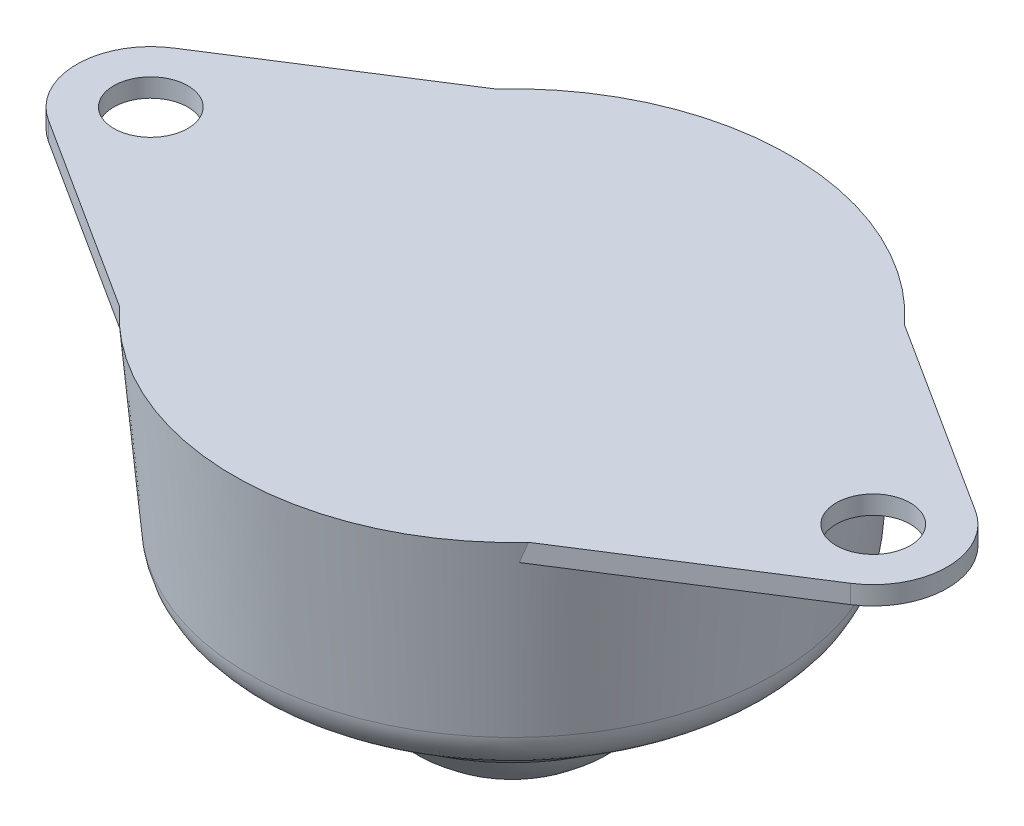
ISO-10303-21;
HEADER;
FILE_DESCRIPTION(('STEP AP214'),'2;1');
FILE_NAME('part.step','',(''),(''),'','','');
FILE_SCHEMA(('AUTOMOTIVE_DESIGN { 1 0 10303 214 1 1 1 1 }'));
ENDSEC;
DATA;
#1=APPLICATION_CONTEXT('core data for automotive mechanical design processes');
#2=APPLICATION_PROTOCOL_DEFINITION('international standard','automotive_design',2000,#1);
#3=PRODUCT_CONTEXT('',#1,'mechanical');
#4=PRODUCT('Part','Part','',(#3));
#5=PRODUCT_RELATED_PRODUCT_CATEGORY('part','',(#4));
#6=PRODUCT_DEFINITION_FORMATION('','',#4);
#7=PRODUCT_DEFINITION_CONTEXT('part definition',#1,'design');
#8=PRODUCT_DEFINITION('design','',#6,#7);
#9=PRODUCT_DEFINITION_SHAPE('','',#8);
#10=(LENGTH_UNIT() NAMED_UNIT(*) SI_UNIT(.MILLI.,.METRE.));
#11=(NAMED_UNIT(*) PLANE_ANGLE_UNIT() SI_UNIT($,.RADIAN.));
#12=(NAMED_UNIT(*) SI_UNIT($,.STERADIAN.) SOLID_ANGLE_UNIT());
#13=UNCERTAINTY_MEASURE_WITH_UNIT(LENGTH_MEASURE(1.E-05),#10,'distance_accuracy_value','');
#14=(GEOMETRIC_REPRESENTATION_CONTEXT(3) GLOBAL_UNCERTAINTY_ASSIGNED_CONTEXT((#13)) GLOBAL_UNIT_ASSIGNED_CONTEXT((#10,
#11,#12)) REPRESENTATION_CONTEXT('',''));
#15=CARTESIAN_POINT('',(0.,0.,0.));
#16=DIRECTION('',(0.,0.,1.));
#17=DIRECTION('',(1.,0.,0.));
#18=AXIS2_PLACEMENT_3D('',#15,#16,#17);
#19=CARTESIAN_POINT('',(0.,-12.,0.));
#20=DIRECTION('',(0.,1.,0.));
#21=DIRECTION('',(-1.,0.,0.));
#22=AXIS2_PLACEMENT_3D('',#19,#20,#21);
#23=CONICAL_SURFACE('',#22,13.9501360376889,0.0872664625997199);
#24=CARTESIAN_POINT('',(0.,-9.71788935686915,0.));
#25=DIRECTION('',(0.,-1.,0.));
#26=DIRECTION('',(1.,0.,0.));
#27=AXIS2_PLACEMENT_3D('',#24,#25,#26);
#28=CIRCLE('',#27,14.1497948478747);
#29=CARTESIAN_POINT('',(14.1497948478747,-9.71788935686915,0.));
#30=VERTEX_POINT('',#29);
#31=EDGE_CURVE('E179',#30,#30,#28,.F.);
#32=ORIENTED_EDGE('',*,*,#31,.T.);
#33=EDGE_LOOP('',(#32));
#34=FACE_BOUND('',#33,.T.);
#35=CARTESIAN_POINT('',(12.6583742323133,6.86786284112785,9.11879372184378));
#36=CARTESIAN_POINT('',(12.6003920496443,6.57767843199839,9.15584489612186));
#37=CARTESIAN_POINT('',(12.5415679806933,6.28773168787597,9.19343404385869));
#38=CARTESIAN_POINT('',(12.4220281046813,5.70837926078128,9.26982117824068));
#39=CARTESIAN_POINT('',(12.3613122422712,5.41897359390268,9.3086192002545));
#40=CARTESIAN_POINT('',(12.1759267618882,4.55125514052083,9.42708231126748));
#41=CARTESIAN_POINT('',(12.0481063039624,3.9738799369211,9.5087608174035));
#42=CARTESIAN_POINT('',(11.7809105112832,2.81904871818081,9.67950150747788));
#43=CARTESIAN_POINT('',(11.6414685443511,2.24161432917767,9.76860627002136));
#44=CARTESIAN_POINT('',(11.3481671171094,1.0920573045864,9.95602871251161));
#45=CARTESIAN_POINT('',(11.1943129585583,0.519932800133823,10.0543430045834));
#46=CARTESIAN_POINT('',(10.9481549744478,-0.331422569697724,10.2116403319586));
#47=CARTESIAN_POINT('',(10.8636242908518,-0.613812602272261,10.2656562545333));
#48=CARTESIAN_POINT('',(10.6881103271886,-1.17584691725177,10.377811371098));
#49=CARTESIAN_POINT('',(10.597125541667,-1.45549054160999,10.4359515270879));
#50=CARTESIAN_POINT('',(10.4069072627371,-2.01114242510658,10.557502843011));
#51=CARTESIAN_POINT('',(10.3076663059839,-2.28714712789051,10.6209187720934));
#52=CARTESIAN_POINT('',(10.0984116977191,-2.8332083135398,10.7546344861701));
#53=CARTESIAN_POINT('',(9.98840361850947,-3.10326778551585,10.8249307104095));
#54=CARTESIAN_POINT('',(9.75267029312679,-3.63588145293457,10.9755665802552));
#55=CARTESIAN_POINT('',(9.62685850941329,-3.89838371025872,11.0559615241851));
#56=CARTESIAN_POINT('',(9.42120113804195,-4.27864714837666,11.1873785691719));
#57=CARTESIAN_POINT('',(9.34997303841065,-4.40293529280569,11.2328940122176));
#58=CARTESIAN_POINT('',(9.2002552075637,-4.64513772320572,11.3285651509691));
#59=CARTESIAN_POINT('',(9.12177271011219,-4.76305817673404,11.3787162242299));
#60=CARTESIAN_POINT('',(8.97781755298206,-4.95876028268787,11.4707049588642));
#61=CARTESIAN_POINT('',(8.91453862597464,-5.03879500540498,11.5111408038903));
#62=CARTESIAN_POINT('',(8.78173412348313,-5.19165304877882,11.596004162602));
#63=CARTESIAN_POINT('',(8.71219721746067,-5.26446276589662,11.6404389166109));
#64=CARTESIAN_POINT('',(8.56493023236199,-5.40007766312354,11.7345439412776));
#65=CARTESIAN_POINT('',(8.48710766081557,-5.46274467828114,11.7842733155165));
#66=CARTESIAN_POINT('',(8.32347478134087,-5.57107922383824,11.8888363046272));
#67=CARTESIAN_POINT('',(8.23769722796723,-5.61681290289329,11.9436489890226));
#68=CARTESIAN_POINT('',(8.08917177595315,-5.67301673193245,12.038558186193));
#69=CARTESIAN_POINT('',(8.02823240777572,-5.69015337123608,12.0774990305491));
#70=CARTESIAN_POINT('',(7.90479060898928,-5.71189795401319,12.1563795312391));
#71=CARTESIAN_POINT('',(7.84228981093424,-5.71651847245105,12.1963181443554));
#72=CARTESIAN_POINT('',(7.7175445664058,-5.71267739152537,12.2760315594534));
#73=CARTESIAN_POINT('',(7.65530030504937,-5.70420759514527,12.3158062431436));
#74=CARTESIAN_POINT('',(7.53283655176791,-5.67518624644612,12.3940617633175));
#75=CARTESIAN_POINT('',(7.47261963795462,-5.65461988251372,12.4325409523628));
#76=CARTESIAN_POINT('',(7.33226393302822,-5.59331193452866,12.5222296023027));
#77=CARTESIAN_POINT('',(7.25361825914272,-5.5478147473501,12.5724849468795));
#78=CARTESIAN_POINT('',(7.1032543698956,-5.44294617875783,12.6685689231835));
#79=CARTESIAN_POINT('',(7.03155340028663,-5.38354144952876,12.7143865347083));
#80=CARTESIAN_POINT('',(6.8348672379271,-5.19964484447264,12.8400708905607));
#81=CARTESIAN_POINT('',(6.71776497186566,-5.06347438771679,12.9149003686603));
#82=CARTESIAN_POINT('',(6.49951128899083,-4.774290494307,13.0543665782576));
#83=CARTESIAN_POINT('',(6.39842194718122,-4.62121523580234,13.1189636432288));
#84=CARTESIAN_POINT('',(6.21841992958215,-4.32275920204267,13.2339866695702));
#85=CARTESIAN_POINT('',(6.13829107086148,-4.17839918396337,13.28518978357));
#86=CARTESIAN_POINT('',(5.98511045483865,-3.88444723663065,13.3830736754663));
#87=CARTESIAN_POINT('',(5.91206274086595,-3.73485238386288,13.4297518696362));
#88=CARTESIAN_POINT('',(5.70093379344831,-3.28005139933578,13.5646653045197));
#89=CARTESIAN_POINT('',(5.5711977808386,-2.96941549621123,13.6475678685846));
#90=CARTESIAN_POINT('',(5.32557992054976,-2.33768864249139,13.8045200516254));
#91=CARTESIAN_POINT('',(5.20982009466687,-2.01653295036784,13.8784916974958));
#92=CARTESIAN_POINT('',(4.98936861817535,-1.36943823208632,14.0193623184238));
#93=CARTESIAN_POINT('',(4.88466264647898,-1.04350603390933,14.0862704447947));
#94=CARTESIAN_POINT('',(4.68751355006937,-0.401089837334021,14.2122506199725));
#95=CARTESIAN_POINT('',(4.59474887646277,-0.0847433650281615,14.2715281416254));
#96=CARTESIAN_POINT('',(4.41531388405231,0.550387216121785,14.3861888333992));
#97=CARTESIAN_POINT('',(4.32864399977681,0.869171496976751,14.4415717258523));
#98=CARTESIAN_POINT('',(4.07591071562002,1.82882077467615,14.6030707334115));
#99=CARTESIAN_POINT('',(3.91728497669503,2.4724404776392,14.70443411139));
#100=CARTESIAN_POINT('',(3.61971486826424,3.74031824024328,14.8945842823546));
#101=CARTESIAN_POINT('',(3.48025900595239,4.36440999304523,14.9836979241799));
#102=CARTESIAN_POINT('',(3.27869181198459,5.30230563542418,15.112501306334));
#103=CARTESIAN_POINT('',(3.21282174743899,5.61498014378576,15.1545929132526));
#104=CARTESIAN_POINT('',(3.08331146192763,6.24096588521668,15.2373512355233));
#105=CARTESIAN_POINT('',(3.01967115057998,6.55427709193186,15.2780180086304));
#106=CARTESIAN_POINT('',(2.95701038307129,6.86786284112785,15.3180588437713));
#107=B_SPLINE_CURVE_WITH_KNOTS('',3,(#35,#36,#37,#38,#39,#40,#41,#42,#43,#44,#45,#46,#47,#48,
#49,#50,#51,#52,#53,#54,#55,#56,#57,#58,#59,#60,#61,#62,#63,#64,#65,#66,#67,#68,#69,#70,#71,#72,
#73,#74,#75,#76,#77,#78,#79,#80,#81,#82,#83,#84,#85,#86,#87,#88,#89,#90,#91,#92,#93,#94,#95,#96,
#97,#98,#99,#100,#101,#102,#103,#104,#105,#106),.UNSPECIFIED.,.F.,.F.,(4,2,2,2,2,2,2,2,2,2,2,2,
2,2,2,2,2,2,2,2,2,2,2,2,2,2,2,2,2,2,2,2,2,2,2,4),(0.,0.894688593174714,1.78940338734534,
3.58018590400965,5.38205427533142,7.1832623838613,8.0822147917833,8.98137757914064,
9.88136220507501,10.7808835008772,11.6855646576258,12.1362372623643,12.5864652270306,
12.9153616655255,13.2448660597731,13.5785374709185,13.9108913156082,14.1329073008202,
14.3547001433793,14.5766319265494,14.7988360209436,15.1085441479165,15.4190026467229,
15.9994285339049,16.5820521399264,17.1002532676922,17.6187485662948,18.6578487684493,
19.7054497064294,20.751676298618,21.7564364804973,22.7612682243388,24.7726541406673,
26.7095070389096,27.6763905761342,28.6432348757821),.UNSPECIFIED.);
#108=CARTESIAN_POINT('',(11.0439513796866,0.,10.1504255045352));
#109=VERTEX_POINT('',#108);
#110=CARTESIAN_POINT('',(10.7428488494448,-0.999999999999999,10.3428329271264));
#111=VERTEX_POINT('',#110);
#112=EDGE_CURVE('E119',#109,#111,#107,.T.);
#113=ORIENTED_EDGE('',*,*,#112,.F.);
#114=CARTESIAN_POINT('',(0.,0.,0.));
#115=DIRECTION('',(0.,1.,0.));
#116=DIRECTION('',(-1.,0.,0.));
#117=AXIS2_PLACEMENT_3D('',#114,#115,#116);
#118=CIRCLE('',#117,15.);
#119=CARTESIAN_POINT('',(-11.0439513796865,0.,10.1504255045353));
#120=VERTEX_POINT('',#119);
#121=EDGE_CURVE('E171',#120,#109,#118,.T.);
#122=ORIENTED_EDGE('',*,*,#121,.F.);
#123=CARTESIAN_POINT('',(-12.6583742323133,6.86786284112785,9.11879372184379));
#124=CARTESIAN_POINT('',(-12.6003920496443,6.57767843199839,9.15584489612187));
#125=CARTESIAN_POINT('',(-12.5415679806933,6.28773168787597,9.1934340438587));
#126=CARTESIAN_POINT('',(-12.4220281046813,5.70837926078128,9.26982117824069));
#127=CARTESIAN_POINT('',(-12.3613122422712,5.41897359390268,9.30861920025451));
#128=CARTESIAN_POINT('',(-12.1759267618882,4.55125514052084,9.42708231126749));
#129=CARTESIAN_POINT('',(-12.0481063039624,3.97387993692111,9.50876081740351));
#130=CARTESIAN_POINT('',(-11.7809105112832,2.81904871818081,9.67950150747788));
#131=CARTESIAN_POINT('',(-11.6414685443511,2.24161432917767,9.76860627002136));
#132=CARTESIAN_POINT('',(-11.3481671171094,1.0920573045864,9.95602871251161));
#133=CARTESIAN_POINT('',(-11.1943129585583,0.519932800133821,10.0543430045834));
#134=CARTESIAN_POINT('',(-10.9481549744478,-0.331422569697725,10.2116403319586));
#135=CARTESIAN_POINT('',(-10.8636242908518,-0.61381260227226,10.2656562545333));
#136=CARTESIAN_POINT('',(-10.6881103271886,-1.17584691725177,10.377811371098));
#137=CARTESIAN_POINT('',(-10.597125541667,-1.45549054160999,10.4359515270879));
#138=CARTESIAN_POINT('',(-10.4069072627371,-2.01114242510658,10.557502843011));
#139=CARTESIAN_POINT('',(-10.3076663059839,-2.28714712789051,10.6209187720934));
#140=CARTESIAN_POINT('',(-10.0984116977191,-2.8332083135398,10.7546344861701));
#141=CARTESIAN_POINT('',(-9.98840361850948,-3.10326778551586,10.8249307104095));
#142=CARTESIAN_POINT('',(-9.75267029312679,-3.63588145293456,10.9755665802552));
#143=CARTESIAN_POINT('',(-9.62685850941328,-3.89838371025871,11.0559615241851));
#144=CARTESIAN_POINT('',(-9.42120113804195,-4.27864714837665,11.1873785691719));
#145=CARTESIAN_POINT('',(-9.34997303841065,-4.40293529280569,11.2328940122176));
#146=CARTESIAN_POINT('',(-9.2002552075637,-4.64513772320572,11.3285651509691));
#147=CARTESIAN_POINT('',(-9.1217727101122,-4.76305817673405,11.3787162242299));
#148=CARTESIAN_POINT('',(-8.97781755298205,-4.95876028268786,11.4707049588642));
#149=CARTESIAN_POINT('',(-8.91453862597462,-5.03879500540496,11.5111408038903));
#150=CARTESIAN_POINT('',(-8.7817341234831,-5.1916530487788,11.596004162602));
#151=CARTESIAN_POINT('',(-8.71219721746065,-5.2644627658966,11.6404389166109));
#152=CARTESIAN_POINT('',(-8.56493023236197,-5.40007766312352,11.7345439412776));
#153=CARTESIAN_POINT('',(-8.48710766081555,-5.46274467828113,11.7842733155165));
#154=CARTESIAN_POINT('',(-8.32347478134085,-5.57107922383821,11.8888363046273));
#155=CARTESIAN_POINT('',(-8.23769722796721,-5.61681290289326,11.9436489890227));
#156=CARTESIAN_POINT('',(-8.08917177595313,-5.67301673193242,12.038558186193));
#157=CARTESIAN_POINT('',(-8.0282324077757,-5.69015337123605,12.0774990305491));
#158=CARTESIAN_POINT('',(-7.90479060898927,-5.71189795401317,12.1563795312392));
#159=CARTESIAN_POINT('',(-7.84228981093422,-5.71651847245103,12.1963181443554));
#160=CARTESIAN_POINT('',(-7.71754456640578,-5.71267739152537,12.2760315594535));
#161=CARTESIAN_POINT('',(-7.65530030504935,-5.70420759514528,12.3158062431437));
#162=CARTESIAN_POINT('',(-7.53283655176789,-5.67518624644612,12.3940617633175));
#163=CARTESIAN_POINT('',(-7.4726196379546,-5.65461988251371,12.4325409523629));
#164=CARTESIAN_POINT('',(-7.3322639330282,-5.59331193452862,12.5222296023027));
#165=CARTESIAN_POINT('',(-7.2536182591427,-5.54781474735009,12.5724849468795));
#166=CARTESIAN_POINT('',(-7.10325436989557,-5.44294617875783,12.6685689231835));
#167=CARTESIAN_POINT('',(-7.0315534002866,-5.38354144952875,12.7143865347083));
#168=CARTESIAN_POINT('',(-6.83486723792708,-5.19964484447261,12.8400708905607));
#169=CARTESIAN_POINT('',(-6.71776497186564,-5.06347438771675,12.9149003686603));
#170=CARTESIAN_POINT('',(-6.49951128899081,-4.77429049430696,13.0543665782576));
#171=CARTESIAN_POINT('',(-6.39842194718119,-4.62121523580229,13.1189636432288));
#172=CARTESIAN_POINT('',(-6.21841992958212,-4.32275920204261,13.2339866695702));
#173=CARTESIAN_POINT('',(-6.13829107086145,-4.17839918396331,13.2851897835701));
#174=CARTESIAN_POINT('',(-5.98511045483861,-3.88444723663057,13.3830736754664));
#175=CARTESIAN_POINT('',(-5.9120627408659,-3.7348523838628,13.4297518696362));
#176=CARTESIAN_POINT('',(-5.70093379344825,-3.28005139933568,13.5646653045197));
#177=CARTESIAN_POINT('',(-5.57119778083855,-2.96941549621111,13.6475678685846));
#178=CARTESIAN_POINT('',(-5.3255799205497,-2.33768864249125,13.8045200516254));
#179=CARTESIAN_POINT('',(-5.20982009466681,-2.01653295036769,13.8784916974958));
#180=CARTESIAN_POINT('',(-4.98936861817528,-1.36943823208614,14.0193623184238));
#181=CARTESIAN_POINT('',(-4.88466264647892,-1.04350603390914,14.0862704447947));
#182=CARTESIAN_POINT('',(-4.68751355006932,-0.401089837333831,14.2122506199725));
#183=CARTESIAN_POINT('',(-4.59474887646272,-0.0847433650279833,14.2715281416255));
#184=CARTESIAN_POINT('',(-4.41531388405226,0.550387216121942,14.3861888333993));
#185=CARTESIAN_POINT('',(-4.32864399977677,0.869171496976898,14.4415717258523));
#186=CARTESIAN_POINT('',(-4.07591071561999,1.82882077467626,14.6030707334115));
#187=CARTESIAN_POINT('',(-3.917284976695,2.4724404776393,14.70443411139));
#188=CARTESIAN_POINT('',(-3.61971486826422,3.74031824024334,14.8945842823546));
#189=CARTESIAN_POINT('',(-3.48025900595237,4.36440999304528,14.9836979241799));
#190=CARTESIAN_POINT('',(-3.27869181198458,5.30230563542422,15.112501306334));
#191=CARTESIAN_POINT('',(-3.21282174743898,5.61498014378579,15.1545929132526));
#192=CARTESIAN_POINT('',(-3.08331146192762,6.2409658852167,15.2373512355233));
#193=CARTESIAN_POINT('',(-3.01967115057997,6.55427709193187,15.2780180086304));
#194=CARTESIAN_POINT('',(-2.95701038307129,6.86786284112786,15.3180588437713));
#195=B_SPLINE_CURVE_WITH_KNOTS('',3,(#123,#124,#125,#126,#127,#128,#129,#130,#131,#132,#133,
#134,#135,#136,#137,#138,#139,#140,#141,#142,#143,#144,#145,#146,#147,#148,#149,#150,#151,#152,
#153,#154,#155,#156,#157,#158,#159,#160,#161,#162,#163,#164,#165,#166,#167,#168,#169,#170,#171,
#172,#173,#174,#175,#176,#177,#178,#179,#180,#181,#182,#183,#184,#185,#186,#187,#188,#189,#190,
#191,#192,#193,#194),.UNSPECIFIED.,.F.,.F.,(4,2,2,2,2,2,2,2,2,2,2,2,2,2,2,2,2,2,2,2,2,2,2,2,2,2,
2,2,2,2,2,2,2,2,2,4),(0.,0.894688593174713,1.78940338734533,3.58018590400965,5.38205427533142,
7.1832623838613,8.0822147917833,8.98137757914064,9.88136220507501,10.7808835008772,
11.6855646576257,12.1362372623643,12.5864652270306,12.9153616655255,13.2448660597731,
13.5785374709185,13.9108913156082,14.1329073008202,14.3547001433793,14.5766319265494,
14.7988360209436,15.1085441479165,15.4190026467229,15.999428533905,16.5820521399265,
17.1002532676922,17.6187485662949,18.6578487684494,19.7054497064296,20.7516762986182,
21.7564364804975,22.7612682243389,24.7726541406673,26.7095070389096,27.6763905761342,
28.6432348757821),.UNSPECIFIED.);
#196=CARTESIAN_POINT('',(-10.7428488494448,-0.999999999999999,10.3428329271264));
#197=VERTEX_POINT('',#196);
#198=EDGE_CURVE('E196',#120,#197,#195,.T.);
#199=ORIENTED_EDGE('',*,*,#198,.T.);
#200=CARTESIAN_POINT('',(0.,-0.999999999999999,0.));
#201=DIRECTION('',(0.,1.,0.));
#202=DIRECTION('',(0.,0.,1.));
#203=AXIS2_PLACEMENT_3D('',#200,#201,#202);
#204=CIRCLE('',#203,14.9125113364741);
#205=CARTESIAN_POINT('',(-10.7428488494448,-0.999999999999999,-10.3428329271264));
#206=VERTEX_POINT('',#205);
#207=EDGE_CURVE('E185',#206,#197,#204,.T.);
#208=ORIENTED_EDGE('',*,*,#207,.F.);
#209=CARTESIAN_POINT('',(-2.95701038307126,6.86786284112786,-15.3180588437713));
#210=CARTESIAN_POINT('',(-3.01499256574029,6.57767843199839,-15.2810076694932));
#211=CARTESIAN_POINT('',(-3.07381663469131,6.28773168787597,-15.2434185217564));
#212=CARTESIAN_POINT('',(-3.19335651070329,5.70837926078127,-15.1670313873744));
#213=CARTESIAN_POINT('',(-3.25407237311344,5.41897359390267,-15.1282333653606));
#214=CARTESIAN_POINT('',(-3.43945785349643,4.55125514052082,-15.0097702543476));
#215=CARTESIAN_POINT('',(-3.56727831142221,3.97387993692109,-14.9280917482116));
#216=CARTESIAN_POINT('',(-3.83447410410144,2.8190487181808,-14.7573510581372));
#217=CARTESIAN_POINT('',(-3.97391607103346,2.24161432917766,-14.6682462955938));
#218=CARTESIAN_POINT('',(-4.26721749827523,1.09205730458639,-14.4808238531035));
#219=CARTESIAN_POINT('',(-4.42107165682633,0.519932800133818,-14.3825095610317));
#220=CARTESIAN_POINT('',(-4.66722964093677,-0.331422569697724,-14.2252122336565));
#221=CARTESIAN_POINT('',(-4.75176032453276,-0.613812602272258,-14.1711963110819));
#222=CARTESIAN_POINT('',(-4.927274288196,-1.17584691725176,-14.0590411945171));
#223=CARTESIAN_POINT('',(-5.01825907371756,-1.45549054160998,-14.0009010385272));
#224=CARTESIAN_POINT('',(-5.20847735264752,-2.01114242510658,-13.8793497226042));
#225=CARTESIAN_POINT('',(-5.30771830940065,-2.28714712789051,-13.8159337935217));
#226=CARTESIAN_POINT('',(-5.51697291766549,-2.8332083135398,-13.6822180794451));
#227=CARTESIAN_POINT('',(-5.62698099687511,-3.10326778551586,-13.6119218552057));
#228=CARTESIAN_POINT('',(-5.86271432225779,-3.63588145293457,-13.4612859853599));
#229=CARTESIAN_POINT('',(-5.9885261059713,-3.89838371025873,-13.3808910414301));
#230=CARTESIAN_POINT('',(-6.19418347734263,-4.27864714837667,-13.2494739964432));
#231=CARTESIAN_POINT('',(-6.26541157697393,-4.4029352928057,-13.2039585533976));
#232=CARTESIAN_POINT('',(-6.41512940782087,-4.64513772320573,-13.108287414646));
#233=CARTESIAN_POINT('',(-6.49361190527237,-4.76305817673407,-13.0581363413852));
#234=CARTESIAN_POINT('',(-6.63756706240251,-4.9587602826879,-12.966147606751));
#235=CARTESIAN_POINT('',(-6.70084598940993,-5.03879500540501,-12.9257117617248));
#236=CARTESIAN_POINT('',(-6.83365049190146,-5.19165304877886,-12.8408484030131));
#237=CARTESIAN_POINT('',(-6.90318739792392,-5.26446276589667,-12.7964136490043));
#238=CARTESIAN_POINT('',(-7.0504543830226,-5.4000776631236,-12.7023086243375));
#239=CARTESIAN_POINT('',(-7.12827695456902,-5.46274467828121,-12.6525792500987));
#240=CARTESIAN_POINT('',(-7.29190983404372,-5.57107922383833,-12.5480162609879));
#241=CARTESIAN_POINT('',(-7.37768738741737,-5.6168129028934,-12.4932035765925));
#242=CARTESIAN_POINT('',(-7.52621283943145,-5.67301673193255,-12.3982943794221));
#243=CARTESIAN_POINT('',(-7.58715220760888,-5.69015337123617,-12.359353535066));
#244=CARTESIAN_POINT('',(-7.71059400639532,-5.71189795401328,-12.280473034376));
#245=CARTESIAN_POINT('',(-7.77309480445036,-5.71651847245116,-12.2405344212597));
#246=CARTESIAN_POINT('',(-7.89784004897879,-5.71267739152549,-12.1608210061617));
#247=CARTESIAN_POINT('',(-7.96008431033523,-5.7042075951454,-12.1210463224715));
#248=CARTESIAN_POINT('',(-8.08254806361668,-5.67518624644624,-12.0427908022976));
#249=CARTESIAN_POINT('',(-8.14276497742998,-5.65461988251384,-12.0043116132523));
#250=CARTESIAN_POINT('',(-8.28312068235637,-5.59331193452877,-11.9146229633124));
#251=CARTESIAN_POINT('',(-8.36176635624187,-5.54781474735024,-11.8643676187356));
#252=CARTESIAN_POINT('',(-8.51213024548899,-5.44294617875799,-11.7682836424316));
#253=CARTESIAN_POINT('',(-8.58383121509797,-5.38354144952893,-11.7224660309068));
#254=CARTESIAN_POINT('',(-8.78051737745748,-5.19964484447283,-11.5967816750545));
#255=CARTESIAN_POINT('',(-8.89761964351891,-5.06347438771699,-11.5219521969549));
#256=CARTESIAN_POINT('',(-9.11587332639373,-4.77429049430722,-11.3824859873576));
#257=CARTESIAN_POINT('',(-9.21696266820333,-4.62121523580257,-11.3178889223863));
#258=CARTESIAN_POINT('',(-9.39696468580239,-4.32275920204293,-11.202865896045));
#259=CARTESIAN_POINT('',(-9.47709354452307,-4.17839918396366,-11.1516627820451));
#260=CARTESIAN_POINT('',(-9.63027416054589,-3.88444723663097,-11.0537788901488));
#261=CARTESIAN_POINT('',(-9.70332187451858,-3.73485238386322,-11.007100695979));
#262=CARTESIAN_POINT('',(-9.91445082193621,-3.28005139933618,-10.8721872610955));
#263=CARTESIAN_POINT('',(-10.0441868345459,-2.96941549621166,-10.7892846970306));
#264=CARTESIAN_POINT('',(-10.2898046948347,-2.33768864249191,-10.6323325139898));
#265=CARTESIAN_POINT('',(-10.4055645207176,-2.0165329503684,-10.5583608681194));
#266=CARTESIAN_POINT('',(-10.6260159972091,-1.36943823208696,-10.4174902471914));
#267=CARTESIAN_POINT('',(-10.7307219689055,-1.04350603391002,-10.3505821208206));
#268=CARTESIAN_POINT('',(-10.9278710653151,-0.401089837334732,-10.2246019456427));
#269=CARTESIAN_POINT('',(-11.0206357389217,-0.084743365028846,-10.1653244239898));
#270=CARTESIAN_POINT('',(-11.2000707313322,0.550387216121153,-10.0506637322159));
#271=CARTESIAN_POINT('',(-11.2867406156077,0.869171496976145,-9.99528083976287));
#272=CARTESIAN_POINT('',(-11.5394738997645,1.82882077467562,-9.83378183220364));
#273=CARTESIAN_POINT('',(-11.6980996386895,2.47244047763873,-9.73241845422513));
#274=CARTESIAN_POINT('',(-11.9956697471203,3.74031824024293,-9.5422682832605));
#275=CARTESIAN_POINT('',(-12.1351256094322,4.36440999304495,-9.4531546414352));
#276=CARTESIAN_POINT('',(-12.3366928034,5.30230563542401,-9.32435125928114));
#277=CARTESIAN_POINT('',(-12.4025628679456,5.61498014378563,-9.28225965236253));
#278=CARTESIAN_POINT('',(-12.532073153457,6.24096588521662,-9.19950133009177));
#279=CARTESIAN_POINT('',(-12.5957134648047,6.55427709193182,-9.15883455698471));
#280=CARTESIAN_POINT('',(-12.6583742323134,6.86786284112786,-9.11879372184376));
#281=B_SPLINE_CURVE_WITH_KNOTS('',3,(#209,#210,#211,#212,#213,#214,#215,#216,#217,#218,#219,
#220,#221,#222,#223,#224,#225,#226,#227,#228,#229,#230,#231,#232,#233,#234,#235,#236,#237,#238,
#239,#240,#241,#242,#243,#244,#245,#246,#247,#248,#249,#250,#251,#252,#253,#254,#255,#256,#257,
#258,#259,#260,#261,#262,#263,#264,#265,#266,#267,#268,#269,#270,#271,#272,#273,#274,#275,#276,
#277,#278,#279,#280),.UNSPECIFIED.,.F.,.F.,(4,2,2,2,2,2,2,2,2,2,2,2,2,2,2,2,2,2,2,2,2,2,2,2,2,2,
2,2,2,2,2,2,2,2,2,4),(0.,0.89468859317472,1.78940338734535,3.58018590400967,5.38205427533143,
7.18326238386129,8.08221479178329,8.98137757914064,9.88136220507501,10.7808835008772,
11.6855646576257,12.1362372623643,12.5864652270305,12.9153616655255,13.2448660597731,
13.5785374709186,13.9108913156082,14.1329073008203,14.3547001433794,14.5766319265495,
14.7988360209437,15.1085441479165,15.419002646723,15.9994285339049,16.5820521399264,
17.1002532676921,17.6187485662947,18.657848768449,19.705449706429,20.7516762986174,
21.7564364804968,22.7612682243384,24.7726541406671,26.7095070389096,27.6763905761343,
28.6432348757824),.UNSPECIFIED.);
#282=CARTESIAN_POINT('',(-11.0439513796866,0.,-10.1504255045352));
#283=VERTEX_POINT('',#282);
#284=EDGE_CURVE('E187',#206,#283,#281,.T.);
#285=ORIENTED_EDGE('',*,*,#284,.T.);
#286=CARTESIAN_POINT('',(11.0439513796866,0.,-10.1504255045352));
#287=VERTEX_POINT('',#286);
#288=EDGE_CURVE('E170',#287,#283,#118,.T.);
#289=ORIENTED_EDGE('',*,*,#288,.F.);
#290=CARTESIAN_POINT('',(2.95701038307126,6.86786284112785,-15.3180588437713));
#291=CARTESIAN_POINT('',(3.01499256574028,6.57767843199839,-15.2810076694932));
#292=CARTESIAN_POINT('',(3.0738166346913,6.28773168787597,-15.2434185217564));
#293=CARTESIAN_POINT('',(3.19335651070328,5.70837926078128,-15.1670313873744));
#294=CARTESIAN_POINT('',(3.25407237311343,5.41897359390268,-15.1282333653606));
#295=CARTESIAN_POINT('',(3.43945785349643,4.55125514052084,-15.0097702543476));
#296=CARTESIAN_POINT('',(3.56727831142221,3.9738799369211,-14.9280917482116));
#297=CARTESIAN_POINT('',(3.83447410410145,2.81904871818081,-14.7573510581372));
#298=CARTESIAN_POINT('',(3.97391607103346,2.24161432917767,-14.6682462955938));
#299=CARTESIAN_POINT('',(4.26721749827524,1.0920573045864,-14.4808238531035));
#300=CARTESIAN_POINT('',(4.42107165682633,0.51993280013382,-14.3825095610317));
#301=CARTESIAN_POINT('',(4.66722964093678,-0.331422569697725,-14.2252122336565));
#302=CARTESIAN_POINT('',(4.75176032453277,-0.613812602272259,-14.1711963110819));
#303=CARTESIAN_POINT('',(4.92727428819601,-1.17584691725177,-14.0590411945171));
#304=CARTESIAN_POINT('',(5.01825907371757,-1.45549054160999,-14.0009010385272));
#305=CARTESIAN_POINT('',(5.20847735264752,-2.01114242510659,-13.8793497226042));
#306=CARTESIAN_POINT('',(5.30771830940066,-2.28714712789052,-13.8159337935217));
#307=CARTESIAN_POINT('',(5.51697291766549,-2.83320831353981,-13.6822180794451));
#308=CARTESIAN_POINT('',(5.62698099687512,-3.10326778551586,-13.6119218552057));
#309=CARTESIAN_POINT('',(5.8627143222578,-3.63588145293457,-13.4612859853599));
#310=CARTESIAN_POINT('',(5.9885261059713,-3.89838371025873,-13.3808910414301));
#311=CARTESIAN_POINT('',(6.19418347734264,-4.27864714837666,-13.2494739964432));
#312=CARTESIAN_POINT('',(6.26541157697394,-4.4029352928057,-13.2039585533976));
#313=CARTESIAN_POINT('',(6.41512940782089,-4.64513772320573,-13.108287414646));
#314=CARTESIAN_POINT('',(6.49361190527238,-4.76305817673406,-13.0581363413852));
#315=CARTESIAN_POINT('',(6.63756706240253,-4.95876028268789,-12.9661476067509));
#316=CARTESIAN_POINT('',(6.70084598940995,-5.03879500540499,-12.9257117617248));
#317=CARTESIAN_POINT('',(6.83365049190147,-5.19165304877884,-12.8408484030131));
#318=CARTESIAN_POINT('',(6.90318739792393,-5.26446276589666,-12.7964136490043));
#319=CARTESIAN_POINT('',(7.05045438302261,-5.40007766312359,-12.7023086243375));
#320=CARTESIAN_POINT('',(7.12827695456903,-5.46274467828119,-12.6525792500987));
#321=CARTESIAN_POINT('',(7.29190983404373,-5.5710792238383,-12.5480162609879));
#322=CARTESIAN_POINT('',(7.37768738741737,-5.61681290289337,-12.4932035765925));
#323=CARTESIAN_POINT('',(7.52621283943145,-5.67301673193253,-12.3982943794221));
#324=CARTESIAN_POINT('',(7.58715220760888,-5.69015337123614,-12.359353535066));
#325=CARTESIAN_POINT('',(7.71059400639532,-5.71189795401326,-12.280473034376));
#326=CARTESIAN_POINT('',(7.77309480445036,-5.71651847245114,-12.2405344212597));
#327=CARTESIAN_POINT('',(7.89784004897879,-5.71267739152548,-12.1608210061617));
#328=CARTESIAN_POINT('',(7.96008431033523,-5.70420759514537,-12.1210463224715));
#329=CARTESIAN_POINT('',(8.08254806361668,-5.67518624644622,-12.0427908022977));
#330=CARTESIAN_POINT('',(8.14276497742998,-5.65461988251383,-12.0043116132523));
#331=CARTESIAN_POINT('',(8.28312068235638,-5.59331193452876,-11.9146229633124));
#332=CARTESIAN_POINT('',(8.36176635624187,-5.54781474735022,-11.8643676187356));
#333=CARTESIAN_POINT('',(8.51213024548899,-5.44294617875796,-11.7682836424316));
#334=CARTESIAN_POINT('',(8.58383121509796,-5.3835414495289,-11.7224660309068));
#335=CARTESIAN_POINT('',(8.78051737745748,-5.1996448444728,-11.5967816750545));
#336=CARTESIAN_POINT('',(8.89761964351892,-5.06347438771696,-11.5219521969549));
#337=CARTESIAN_POINT('',(9.11587332639374,-4.77429049430719,-11.3824859873575));
#338=CARTESIAN_POINT('',(9.21696266820334,-4.62121523580254,-11.3178889223863));
#339=CARTESIAN_POINT('',(9.3969646858024,-4.32275920204289,-11.202865896045));
#340=CARTESIAN_POINT('',(9.47709354452307,-4.17839918396361,-11.1516627820451));
#341=CARTESIAN_POINT('',(9.63027416054589,-3.88444723663093,-11.0537788901488));
#342=CARTESIAN_POINT('',(9.70332187451858,-3.73485238386317,-11.007100695979));
#343=CARTESIAN_POINT('',(9.91445082193621,-3.28005139933613,-10.8721872610955));
#344=CARTESIAN_POINT('',(10.0441868345459,-2.96941549621161,-10.7892846970306));
#345=CARTESIAN_POINT('',(10.2898046948347,-2.33768864249185,-10.6323325139898));
#346=CARTESIAN_POINT('',(10.4055645207176,-2.01653295036834,-10.5583608681194));
#347=CARTESIAN_POINT('',(10.6260159972091,-1.36943823208689,-10.4174902471914));
#348=CARTESIAN_POINT('',(10.7307219689055,-1.04350603390994,-10.3505821208206));
#349=CARTESIAN_POINT('',(10.9278710653151,-0.401089837334654,-10.2246019456427));
#350=CARTESIAN_POINT('',(11.0206357389217,-0.0847433650287676,-10.1653244239898));
#351=CARTESIAN_POINT('',(11.2000707313322,0.55038721612123,-10.0506637322159));
#352=CARTESIAN_POINT('',(11.2867406156077,0.869171496976221,-9.99528083976288));
#353=CARTESIAN_POINT('',(11.5394738997645,1.82882077467569,-9.83378183220365));
#354=CARTESIAN_POINT('',(11.6980996386895,2.4724404776388,-9.73241845422514));
#355=CARTESIAN_POINT('',(11.9956697471203,3.74031824024298,-9.54226828326051));
#356=CARTESIAN_POINT('',(12.1351256094322,4.36440999304499,-9.4531546414352));
#357=CARTESIAN_POINT('',(12.3366928034,5.30230563542403,-9.32435125928115));
#358=CARTESIAN_POINT('',(12.4025628679456,5.61498014378565,-9.28225965236254));
#359=CARTESIAN_POINT('',(12.532073153457,6.24096588521663,-9.19950133009178));
#360=CARTESIAN_POINT('',(12.5957134648047,6.55427709193183,-9.15883455698472));
#361=CARTESIAN_POINT('',(12.6583742323134,6.86786284112785,-9.11879372184378));
#362=B_SPLINE_CURVE_WITH_KNOTS('',3,(#290,#291,#292,#293,#294,#295,#296,#297,#298,#299,#300,
#301,#302,#303,#304,#305,#306,#307,#308,#309,#310,#311,#312,#313,#314,#315,#316,#317,#318,#319,
#320,#321,#322,#323,#324,#325,#326,#327,#328,#329,#330,#331,#332,#333,#334,#335,#336,#337,#338,
#339,#340,#341,#342,#343,#344,#345,#346,#347,#348,#349,#350,#351,#352,#353,#354,#355,#356,#357,
#358,#359,#360,#361),.UNSPECIFIED.,.F.,.F.,(4,2,2,2,2,2,2,2,2,2,2,2,2,2,2,2,2,2,2,2,2,2,2,2,2,2,
2,2,2,2,2,2,2,2,2,4),(0.,0.894688593174714,1.78940338734533,3.58018590400965,5.38205427533142,
7.18326238386129,8.0822147917833,8.98137757914064,9.88136220507501,10.7808835008772,
11.6855646576257,12.1362372623643,12.5864652270305,12.9153616655255,13.2448660597731,
13.5785374709185,13.9108913156082,14.1329073008203,14.3547001433794,14.5766319265495,
14.7988360209436,15.1085441479165,15.4190026467229,15.9994285339049,16.5820521399264,
17.1002532676921,17.6187485662947,18.657848768449,19.705449706429,20.7516762986174,
21.7564364804969,22.7612682243384,24.7726541406671,26.7095070389096,27.6763905761343,
28.6432348757823),.UNSPECIFIED.);
#363=CARTESIAN_POINT('',(10.7428488494448,-0.999999999999999,-10.3428329271264));
#364=VERTEX_POINT('',#363);
#365=EDGE_CURVE('E220',#364,#287,#362,.T.);
#366=ORIENTED_EDGE('',*,*,#365,.F.);
#367=EDGE_CURVE('E188',#111,#364,#204,.T.);
#368=ORIENTED_EDGE('',*,*,#367,.F.);
#369=EDGE_LOOP('',(#113,#122,#199,#208,#285,#289,#366,#368));
#370=FACE_BOUND('',#369,.T.);
#371=ADVANCED_FACE('F36',(#34,#370),#23,.T.);
#372=CARTESIAN_POINT('',(0.,0.,0.));
#373=DIRECTION('',(0.,-1.,0.));
#374=DIRECTION('',(1.,0.,0.));
#375=AXIS2_PLACEMENT_3D('',#372,#373,#374);
#376=PLANE('',#375);
#377=ORIENTED_EDGE('',*,*,#121,.T.);
#378=DIRECTION('',(-0.842650088469486,0.,0.538461538461539));
#379=VECTOR('',#378,1.);
#380=CARTESIAN_POINT('',(7.80769230769232,0.,12.2184262828076));
#381=LINE('',#380,#379);
#382=CARTESIAN_POINT('',(21.6538461538462,0.,3.37060035387794));
#383=VERTEX_POINT('',#382);
#384=EDGE_CURVE('E144',#383,#109,#381,.T.);
#385=ORIENTED_EDGE('',*,*,#384,.F.);
#386=CARTESIAN_POINT('',(19.5,0.,0.));
#387=DIRECTION('',(0.,1.,0.));
#388=DIRECTION('',(0.,0.,1.));
#389=AXIS2_PLACEMENT_3D('',#386,#387,#388);
#390=CIRCLE('',#389,4.);
#391=CARTESIAN_POINT('',(21.6538461538462,0.,-3.37060035387795));
#392=VERTEX_POINT('',#391);
#393=EDGE_CURVE('E109',#383,#392,#390,.T.);
#394=ORIENTED_EDGE('',*,*,#393,.T.);
#395=DIRECTION('',(0.842650088469486,0.,0.538461538461539));
#396=VECTOR('',#395,1.);
#397=CARTESIAN_POINT('',(7.80769230769231,0.,-12.2184262828076));
#398=LINE('',#397,#396);
#399=EDGE_CURVE('E51',#287,#392,#398,.T.);
#400=ORIENTED_EDGE('',*,*,#399,.F.);
#401=ORIENTED_EDGE('',*,*,#288,.T.);
#402=DIRECTION('',(-0.842650088469486,0.,0.538461538461539));
#403=VECTOR('',#402,1.);
#404=CARTESIAN_POINT('',(-7.80769230769231,0.,-12.2184262828075));
#405=LINE('',#404,#403);
#406=CARTESIAN_POINT('',(-21.6538461538462,0.,-3.37060035387794));
#407=VERTEX_POINT('',#406);
#408=EDGE_CURVE('E148',#283,#407,#405,.T.);
#409=ORIENTED_EDGE('',*,*,#408,.T.);
#410=CARTESIAN_POINT('',(-19.5,0.,0.));
#411=DIRECTION('',(0.,1.,0.));
#412=DIRECTION('',(0.,0.,1.));
#413=AXIS2_PLACEMENT_3D('',#410,#411,#412);
#414=CIRCLE('',#413,4.);
#415=CARTESIAN_POINT('',(-21.6538461538462,0.,3.37060035387794));
#416=VERTEX_POINT('',#415);
#417=EDGE_CURVE('E150',#407,#416,#414,.T.);
#418=ORIENTED_EDGE('',*,*,#417,.T.);
#419=DIRECTION('',(0.842650088469486,0.,0.538461538461539));
#420=VECTOR('',#419,1.);
#421=CARTESIAN_POINT('',(-7.80769230769232,0.,12.2184262828076));
#422=LINE('',#421,#420);
#423=EDGE_CURVE('E58',#416,#120,#422,.T.);
#424=ORIENTED_EDGE('',*,*,#423,.T.);
#425=EDGE_LOOP('',(#377,#385,#394,#400,#401,#409,#418,#424));
#426=FACE_BOUND('',#425,.T.);
#427=CARTESIAN_POINT('',(-19.5,0.,0.));
#428=DIRECTION('',(0.,1.,0.));
#429=DIRECTION('',(0.,0.,1.));
#430=AXIS2_PLACEMENT_3D('',#427,#428,#429);
#431=CIRCLE('',#430,2.);
#432=CARTESIAN_POINT('',(-19.5,0.,2.));
#433=VERTEX_POINT('',#432);
#434=EDGE_CURVE('E153',#433,#433,#431,.T.);
#435=ORIENTED_EDGE('',*,*,#434,.F.);
#436=EDGE_LOOP('',(#435));
#437=FACE_BOUND('',#436,.T.);
#438=CARTESIAN_POINT('',(19.5,0.,0.));
#439=DIRECTION('',(0.,1.,0.));
#440=DIRECTION('',(0.,0.,1.));
#441=AXIS2_PLACEMENT_3D('',#438,#439,#440);
#442=CIRCLE('',#441,2.);
#443=CARTESIAN_POINT('',(19.5,0.,1.99999999999999));
#444=VERTEX_POINT('',#443);
#445=EDGE_CURVE('E122',#444,#444,#442,.T.);
#446=ORIENTED_EDGE('',*,*,#445,.F.);
#447=EDGE_LOOP('',(#446));
#448=FACE_BOUND('',#447,.T.);
#449=ADVANCED_FACE('F249',(#426,#437,#448),#376,.F.);
#450=CARTESIAN_POINT('',(0.,-12.,0.));
#451=DIRECTION('',(0.,1.,0.));
#452=DIRECTION('',(-1.,0.,0.));
#453=AXIS2_PLACEMENT_3D('',#450,#451,#452);
#454=PLANE('',#453);
#455=CARTESIAN_POINT('',(0.,-12.,0.));
#456=DIRECTION('',(0.,1.,0.));
#457=DIRECTION('',(-1.,0.,0.));
#458=AXIS2_PLACEMENT_3D('',#455,#456,#457);
#459=CIRCLE('',#458,11.6593081026453);
#460=CARTESIAN_POINT('',(-11.6593081026453,-12.,0.));
#461=VERTEX_POINT('',#460);
#462=EDGE_CURVE('E182',#461,#461,#459,.F.);
#463=ORIENTED_EDGE('',*,*,#462,.T.);
#464=EDGE_LOOP('',(#463));
#465=FACE_BOUND('',#464,.T.);
#466=CARTESIAN_POINT('',(0.,-12.,0.));
#467=DIRECTION('',(0.,1.,0.));
#468=DIRECTION('',(-1.,0.,0.));
#469=AXIS2_PLACEMENT_3D('',#466,#467,#468);
#470=CIRCLE('',#469,10.7320508075689);
#471=CARTESIAN_POINT('',(-10.7320508075689,-12.,0.));
#472=VERTEX_POINT('',#471);
#473=EDGE_CURVE('E167',#472,#472,#470,.T.);
#474=ORIENTED_EDGE('',*,*,#473,.T.);
#475=EDGE_LOOP('',(#474));
#476=FACE_BOUND('',#475,.T.);
#477=ADVANCED_FACE('F246',(#465,#476),#454,.F.);
#478=CARTESIAN_POINT('',(0.,-15.,0.));
#479=DIRECTION('',(0.,1.,0.));
#480=DIRECTION('',(-1.,0.,0.));
#481=AXIS2_PLACEMENT_3D('',#478,#479,#480);
#482=CONICAL_SURFACE('',#481,9.,0.523598775598296);
#483=CARTESIAN_POINT('',(0.,-13.75,0.));
#484=DIRECTION('',(0.,-1.,0.));
#485=DIRECTION('',(1.,0.,0.));
#486=AXIS2_PLACEMENT_3D('',#483,#484,#485);
#487=CIRCLE('',#486,9.72168783648703);
#488=CARTESIAN_POINT('',(9.72168783648703,-13.75,0.));
#489=VERTEX_POINT('',#488);
#490=EDGE_CURVE('E173',#489,#489,#487,.F.);
#491=ORIENTED_EDGE('',*,*,#490,.T.);
#492=EDGE_LOOP('',(#491));
#493=FACE_BOUND('',#492,.T.);
#494=ORIENTED_EDGE('',*,*,#473,.F.);
#495=EDGE_LOOP('',(#494));
#496=FACE_BOUND('',#495,.T.);
#497=ADVANCED_FACE('F243',(#493,#496),#482,.T.);
#498=CARTESIAN_POINT('',(0.,-15.,0.));
#499=DIRECTION('',(0.,1.,0.));
#500=DIRECTION('',(-1.,0.,0.));
#501=AXIS2_PLACEMENT_3D('',#498,#499,#500);
#502=PLANE('',#501);
#503=CARTESIAN_POINT('',(0.,-15.,0.));
#504=DIRECTION('',(0.,1.,0.));
#505=DIRECTION('',(-1.,0.,0.));
#506=AXIS2_PLACEMENT_3D('',#503,#504,#505);
#507=CIRCLE('',#506,7.41143332988261);
#508=CARTESIAN_POINT('',(-7.41143332988261,-15.,0.));
#509=VERTEX_POINT('',#508);
#510=EDGE_CURVE('E44',#509,#509,#507,.T.);
#511=ORIENTED_EDGE('',*,*,#510,.T.);
#512=EDGE_LOOP('',(#511));
#513=FACE_BOUND('',#512,.T.);
#514=CARTESIAN_POINT('',(0.,-15.,0.));
#515=DIRECTION('',(0.,1.,0.));
#516=DIRECTION('',(-1.,0.,0.));
#517=AXIS2_PLACEMENT_3D('',#514,#515,#516);
#518=CIRCLE('',#517,7.55662432702593);
#519=CARTESIAN_POINT('',(-7.55662432702593,-15.,0.));
#520=VERTEX_POINT('',#519);
#521=EDGE_CURVE('E176',#520,#520,#518,.F.);
#522=ORIENTED_EDGE('',*,*,#521,.T.);
#523=EDGE_LOOP('',(#522));
#524=FACE_BOUND('',#523,.T.);
#525=ADVANCED_FACE('F239',(#513,#524),#502,.F.);
#526=CARTESIAN_POINT('',(0.,-15.,0.));
#527=DIRECTION('',(0.,-1.,0.));
#528=DIRECTION('',(1.,0.,0.));
#529=AXIS2_PLACEMENT_3D('',#526,#527,#528);
#530=CONICAL_SURFACE('',#529,7.30787993928934,0.785398163397465);
#531=CARTESIAN_POINT('',(0.,-14.9267766952966,0.));
#532=DIRECTION('',(0.,-1.,0.));
#533=DIRECTION('',(1.,0.,0.));
#534=AXIS2_PLACEMENT_3D('',#531,#532,#533);
#535=CIRCLE('',#534,7.23465663458597);
#536=CARTESIAN_POINT('',(7.23465663458597,-14.9267766952966,0.));
#537=VERTEX_POINT('',#536);
#538=EDGE_CURVE('E11',#537,#537,#535,.T.);
#539=ORIENTED_EDGE('',*,*,#538,.T.);
#540=EDGE_LOOP('',(#539));
#541=FACE_BOUND('',#540,.T.);
#542=CARTESIAN_POINT('',(0.,-14.8232233047034,0.));
#543=DIRECTION('',(0.,1.,0.));
#544=DIRECTION('',(-1.,0.,0.));
#545=AXIS2_PLACEMENT_3D('',#542,#543,#544);
#546=CIRCLE('',#545,7.1311032439927);
#547=CARTESIAN_POINT('',(-7.1311032439927,-14.8232233047034,0.));
#548=VERTEX_POINT('',#547);
#549=EDGE_CURVE('E160',#548,#548,#546,.T.);
#550=ORIENTED_EDGE('',*,*,#549,.T.);
#551=EDGE_LOOP('',(#550));
#552=FACE_BOUND('',#551,.T.);
#553=ADVANCED_FACE('F235',(#541,#552),#530,.F.);
#554=CARTESIAN_POINT('',(0.,-12.5,0.));
#555=DIRECTION('',(0.,1.,0.));
#556=DIRECTION('',(-1.,0.,0.));
#557=AXIS2_PLACEMENT_3D('',#554,#555,#556);
#558=SPHERICAL_SURFACE('',#557,7.5);
#559=ORIENTED_EDGE('',*,*,#549,.F.);
#560=EDGE_LOOP('',(#559));
#561=FACE_BOUND('',#560,.T.);
#562=ADVANCED_FACE('F231',(#561),#558,.T.);
#563=CARTESIAN_POINT('',(0.,-12.5,0.));
#564=DIRECTION('',(0.,1.,0.));
#565=DIRECTION('',(-1.,0.,0.));
#566=AXIS2_PLACEMENT_3D('',#563,#564,#565);
#567=TOROIDAL_SURFACE('',#566,7.55662432702593,2.5);
#568=ORIENTED_EDGE('',*,*,#521,.F.);
#569=EDGE_LOOP('',(#568));
#570=FACE_BOUND('',#569,.T.);
#571=ORIENTED_EDGE('',*,*,#490,.F.);
#572=EDGE_LOOP('',(#571));
#573=FACE_BOUND('',#572,.T.);
#574=ADVANCED_FACE('F234',(#570,#573),#567,.T.);
#575=CARTESIAN_POINT('',(0.,-9.5,0.));
#576=DIRECTION('',(0.,1.,0.));
#577=DIRECTION('',(-1.,0.,0.));
#578=AXIS2_PLACEMENT_3D('',#575,#576,#577);
#579=TOROIDAL_SURFACE('',#578,11.6593081026453,2.5);
#580=ORIENTED_EDGE('',*,*,#462,.F.);
#581=EDGE_LOOP('',(#580));
#582=FACE_BOUND('',#581,.T.);
#583=ORIENTED_EDGE('',*,*,#31,.F.);
#584=EDGE_LOOP('',(#583));
#585=FACE_BOUND('',#584,.T.);
#586=ADVANCED_FACE('F283',(#582,#585),#579,.T.);
#587=CARTESIAN_POINT('',(-19.5,-1.,0.));
#588=DIRECTION('',(0.,1.,0.));
#589=DIRECTION('',(0.,0.,1.));
#590=AXIS2_PLACEMENT_3D('',#587,#588,#589);
#591=CYLINDRICAL_SURFACE('',#590,2.);
#592=CARTESIAN_POINT('',(-19.5,-1.,0.));
#593=DIRECTION('',(0.,1.,0.));
#594=DIRECTION('',(0.,0.,1.));
#595=AXIS2_PLACEMENT_3D('',#592,#593,#594);
#596=CIRCLE('',#595,2.);
#597=CARTESIAN_POINT('',(-19.5,-1.,2.));
#598=VERTEX_POINT('',#597);
#599=EDGE_CURVE('E139',#598,#598,#596,.T.);
#600=ORIENTED_EDGE('',*,*,#599,.F.);
#601=EDGE_LOOP('',(#600));
#602=FACE_BOUND('',#601,.T.);
#603=ORIENTED_EDGE('',*,*,#434,.T.);
#604=EDGE_LOOP('',(#603));
#605=FACE_BOUND('',#604,.T.);
#606=ADVANCED_FACE('F281',(#602,#605),#591,.F.);
#607=CARTESIAN_POINT('',(-19.5,-1.,0.));
#608=DIRECTION('',(0.,1.,0.));
#609=DIRECTION('',(0.,0.,1.));
#610=AXIS2_PLACEMENT_3D('',#607,#608,#609);
#611=CYLINDRICAL_SURFACE('',#610,4.);
#612=ORIENTED_EDGE('',*,*,#417,.F.);
#613=DIRECTION('',(0.,1.,0.));
#614=VECTOR('',#613,1.);
#615=CARTESIAN_POINT('',(-21.6538461538462,-1.,-3.37060035387794));
#616=LINE('',#615,#614);
#617=CARTESIAN_POINT('',(-21.6538461538462,-1.,-3.37060035387794));
#618=VERTEX_POINT('',#617);
#619=EDGE_CURVE('E161',#618,#407,#616,.T.);
#620=ORIENTED_EDGE('',*,*,#619,.F.);
#621=CARTESIAN_POINT('',(-19.5,-1.,0.));
#622=DIRECTION('',(0.,1.,0.));
#623=DIRECTION('',(0.,0.,1.));
#624=AXIS2_PLACEMENT_3D('',#621,#622,#623);
#625=CIRCLE('',#624,4.);
#626=CARTESIAN_POINT('',(-21.6538461538462,-1.,3.37060035387794));
#627=VERTEX_POINT('',#626);
#628=EDGE_CURVE('E133',#618,#627,#625,.T.);
#629=ORIENTED_EDGE('',*,*,#628,.T.);
#630=DIRECTION('',(0.,1.,0.));
#631=VECTOR('',#630,1.);
#632=CARTESIAN_POINT('',(-21.6538461538462,-1.,3.37060035387794));
#633=LINE('',#632,#631);
#634=EDGE_CURVE('E158',#627,#416,#633,.T.);
#635=ORIENTED_EDGE('',*,*,#634,.T.);
#636=EDGE_LOOP('',(#612,#620,#629,#635));
#637=FACE_BOUND('',#636,.T.);
#638=ADVANCED_FACE('F213',(#637),#611,.T.);
#639=CARTESIAN_POINT('',(0.,-1.,0.));
#640=DIRECTION('',(0.,1.,0.));
#641=DIRECTION('',(0.,0.,1.));
#642=AXIS2_PLACEMENT_3D('',#639,#640,#641);
#643=PLANE('',#642);
#644=DIRECTION('',(-0.842650088469486,0.,0.538461538461539));
#645=VECTOR('',#644,1.);
#646=CARTESIAN_POINT('',(-7.80769230769231,-1.,-12.2184262828075));
#647=LINE('',#646,#645);
#648=EDGE_CURVE('E129',#206,#618,#647,.T.);
#649=ORIENTED_EDGE('',*,*,#648,.F.);
#650=ORIENTED_EDGE('',*,*,#207,.T.);
#651=DIRECTION('',(0.842650088469486,0.,0.538461538461539));
#652=VECTOR('',#651,1.);
#653=CARTESIAN_POINT('',(-7.80769230769232,-1.,12.2184262828076));
#654=LINE('',#653,#652);
#655=EDGE_CURVE('E136',#627,#197,#654,.T.);
#656=ORIENTED_EDGE('',*,*,#655,.F.);
#657=ORIENTED_EDGE('',*,*,#628,.F.);
#658=EDGE_LOOP('',(#649,#650,#656,#657));
#659=FACE_BOUND('',#658,.T.);
#660=ORIENTED_EDGE('',*,*,#599,.T.);
#661=EDGE_LOOP('',(#660));
#662=FACE_BOUND('',#661,.T.);
#663=ADVANCED_FACE('F211',(#659,#662),#643,.F.);
#664=CARTESIAN_POINT('',(-7.80769230769231,-1.,-12.2184262828075));
#665=DIRECTION('',(-0.538461538461539,0.,-0.842650088469486));
#666=DIRECTION('',(-0.842650088469486,0.,0.538461538461539));
#667=AXIS2_PLACEMENT_3D('',#664,#665,#666);
#668=PLANE('',#667);
#669=ORIENTED_EDGE('',*,*,#284,.F.);
#670=ORIENTED_EDGE('',*,*,#648,.T.);
#671=ORIENTED_EDGE('',*,*,#619,.T.);
#672=ORIENTED_EDGE('',*,*,#408,.F.);
#673=EDGE_LOOP('',(#669,#670,#671,#672));
#674=FACE_BOUND('',#673,.T.);
#675=ADVANCED_FACE('F205',(#674),#668,.T.);
#676=CARTESIAN_POINT('',(-7.80769230769232,-1.,12.2184262828076));
#677=DIRECTION('',(-0.538461538461539,0.,0.842650088469486));
#678=DIRECTION('',(0.842650088469486,0.,0.538461538461539));
#679=AXIS2_PLACEMENT_3D('',#676,#677,#678);
#680=PLANE('',#679);
#681=ORIENTED_EDGE('',*,*,#198,.F.);
#682=ORIENTED_EDGE('',*,*,#423,.F.);
#683=ORIENTED_EDGE('',*,*,#634,.F.);
#684=ORIENTED_EDGE('',*,*,#655,.T.);
#685=EDGE_LOOP('',(#681,#682,#683,#684));
#686=FACE_BOUND('',#685,.T.);
#687=ADVANCED_FACE('F210',(#686),#680,.T.);
#688=CARTESIAN_POINT('',(7.80769230769232,-1.,12.2184262828076));
#689=DIRECTION('',(-0.538461538461539,0.,-0.842650088469486));
#690=DIRECTION('',(-0.842650088469486,0.,0.538461538461539));
#691=AXIS2_PLACEMENT_3D('',#688,#689,#690);
#692=PLANE('',#691);
#693=ORIENTED_EDGE('',*,*,#384,.T.);
#694=ORIENTED_EDGE('',*,*,#112,.T.);
#695=DIRECTION('',(-0.842650088469486,0.,0.538461538461539));
#696=VECTOR('',#695,1.);
#697=CARTESIAN_POINT('',(7.80769230769232,-1.,12.2184262828076));
#698=LINE('',#697,#696);
#699=CARTESIAN_POINT('',(21.6538461538462,-1.,3.37060035387794));
#700=VERTEX_POINT('',#699);
#701=EDGE_CURVE('E116',#700,#111,#698,.T.);
#702=ORIENTED_EDGE('',*,*,#701,.F.);
#703=DIRECTION('',(0.,1.,0.));
#704=VECTOR('',#703,1.);
#705=CARTESIAN_POINT('',(21.6538461538462,-1.,3.37060035387794));
#706=LINE('',#705,#704);
#707=EDGE_CURVE('E103',#700,#383,#706,.T.);
#708=ORIENTED_EDGE('',*,*,#707,.T.);
#709=EDGE_LOOP('',(#693,#694,#702,#708));
#710=FACE_BOUND('',#709,.T.);
#711=ADVANCED_FACE('F117',(#710),#692,.F.);
#712=CARTESIAN_POINT('',(7.80769230769231,-1.,-12.2184262828076));
#713=DIRECTION('',(-0.538461538461539,0.,0.842650088469486));
#714=DIRECTION('',(0.842650088469486,0.,0.538461538461539));
#715=AXIS2_PLACEMENT_3D('',#712,#713,#714);
#716=PLANE('',#715);
#717=DIRECTION('',(0.842650088469486,0.,0.538461538461539));
#718=VECTOR('',#717,1.);
#719=CARTESIAN_POINT('',(7.80769230769231,-1.,-12.2184262828076));
#720=LINE('',#719,#718);
#721=CARTESIAN_POINT('',(21.6538461538462,-1.,-3.37060035387795));
#722=VERTEX_POINT('',#721);
#723=EDGE_CURVE('E126',#364,#722,#720,.T.);
#724=ORIENTED_EDGE('',*,*,#723,.F.);
#725=ORIENTED_EDGE('',*,*,#365,.T.);
#726=ORIENTED_EDGE('',*,*,#399,.T.);
#727=DIRECTION('',(0.,1.,0.));
#728=VECTOR('',#727,1.);
#729=CARTESIAN_POINT('',(21.6538461538462,-1.,-3.37060035387795));
#730=LINE('',#729,#728);
#731=EDGE_CURVE('E112',#722,#392,#730,.T.);
#732=ORIENTED_EDGE('',*,*,#731,.F.);
#733=EDGE_LOOP('',(#724,#725,#726,#732));
#734=FACE_BOUND('',#733,.T.);
#735=ADVANCED_FACE('F214',(#734),#716,.F.);
#736=CARTESIAN_POINT('',(19.5,-1.,0.));
#737=DIRECTION('',(0.,1.,0.));
#738=DIRECTION('',(0.,0.,1.));
#739=AXIS2_PLACEMENT_3D('',#736,#737,#738);
#740=CIRCLE('',#739,2.);
#741=CARTESIAN_POINT('',(19.5,-1.,1.99999999999999));
#742=VERTEX_POINT('',#741);
#743=EDGE_CURVE('E113',#742,#742,#740,.T.);
#744=ORIENTED_EDGE('',*,*,#743,.T.);
#745=EDGE_LOOP('',(#744));
#746=FACE_BOUND('',#745,.T.);
#747=ORIENTED_EDGE('',*,*,#701,.T.);
#748=ORIENTED_EDGE('',*,*,#367,.T.);
#749=ORIENTED_EDGE('',*,*,#723,.T.);
#750=CARTESIAN_POINT('',(19.5,-1.,0.));
#751=DIRECTION('',(0.,1.,0.));
#752=DIRECTION('',(0.,0.,1.));
#753=AXIS2_PLACEMENT_3D('',#750,#751,#752);
#754=CIRCLE('',#753,4.);
#755=EDGE_CURVE('E108',#700,#722,#754,.T.);
#756=ORIENTED_EDGE('',*,*,#755,.F.);
#757=EDGE_LOOP('',(#747,#748,#749,#756));
#758=FACE_BOUND('',#757,.T.);
#759=ADVANCED_FACE('F124',(#746,#758),#643,.F.);
#760=CARTESIAN_POINT('',(19.5,-1.,0.));
#761=DIRECTION('',(0.,1.,0.));
#762=DIRECTION('',(0.,0.,1.));
#763=AXIS2_PLACEMENT_3D('',#760,#761,#762);
#764=CYLINDRICAL_SURFACE('',#763,4.);
#765=ORIENTED_EDGE('',*,*,#393,.F.);
#766=ORIENTED_EDGE('',*,*,#707,.F.);
#767=ORIENTED_EDGE('',*,*,#755,.T.);
#768=ORIENTED_EDGE('',*,*,#731,.T.);
#769=EDGE_LOOP('',(#765,#766,#767,#768));
#770=FACE_BOUND('',#769,.T.);
#771=ADVANCED_FACE('F105',(#770),#764,.T.);
#772=CARTESIAN_POINT('',(19.5,-1.,0.));
#773=DIRECTION('',(0.,1.,0.));
#774=DIRECTION('',(0.,0.,1.));
#775=AXIS2_PLACEMENT_3D('',#772,#773,#774);
#776=CYLINDRICAL_SURFACE('',#775,2.);
#777=ORIENTED_EDGE('',*,*,#743,.F.);
#778=EDGE_LOOP('',(#777));
#779=FACE_BOUND('',#778,.T.);
#780=ORIENTED_EDGE('',*,*,#445,.T.);
#781=EDGE_LOOP('',(#780));
#782=FACE_BOUND('',#781,.T.);
#783=ADVANCED_FACE('F269',(#779,#782),#776,.F.);
#784=CARTESIAN_POINT('',(0.,-14.75,0.));
#785=DIRECTION('',(0.,1.,0.));
#786=DIRECTION('',(-1.,0.,0.));
#787=AXIS2_PLACEMENT_3D('',#784,#785,#786);
#788=TOROIDAL_SURFACE('',#787,7.41143332988261,0.25);
#789=ORIENTED_EDGE('',*,*,#538,.F.);
#790=EDGE_LOOP('',(#789));
#791=FACE_BOUND('',#790,.T.);
#792=ORIENTED_EDGE('',*,*,#510,.F.);
#793=EDGE_LOOP('',(#792));
#794=FACE_BOUND('',#793,.T.);
#795=ADVANCED_FACE('F38',(#791,#794),#788,.T.);
#796=CLOSED_SHELL('',(#371,#449,#477,#497,#525,#553,#562,#574,#586,#606,#638,#663,#675,#687,
#711,#735,#759,#771,#783,#795));
#797=MANIFOLD_SOLID_BREP('B2',#796);
#798=ADVANCED_BREP_SHAPE_REPRESENTATION('',(#18,#797),#14);
#799=SHAPE_DEFINITION_REPRESENTATION(#9,#798);
ENDSEC;
END-ISO-10303-21;
